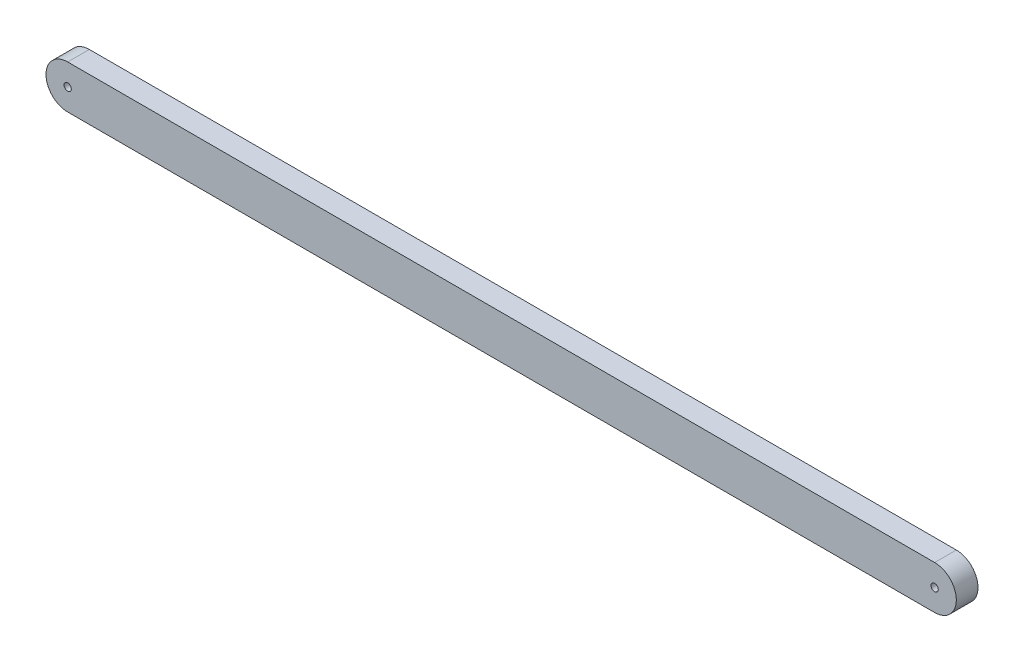
ISO-10303-21;
HEADER;
FILE_DESCRIPTION(('STEP AP214'),'2;1');
FILE_NAME('part.step','',(''),(''),'','','');
FILE_SCHEMA(('AUTOMOTIVE_DESIGN { 1 0 10303 214 1 1 1 1 }'));
ENDSEC;
DATA;
#1=APPLICATION_CONTEXT('core data for automotive mechanical design processes');
#2=APPLICATION_PROTOCOL_DEFINITION('international standard','automotive_design',2000,#1);
#3=PRODUCT_CONTEXT('',#1,'mechanical');
#4=PRODUCT('Part','Part','',(#3));
#5=PRODUCT_RELATED_PRODUCT_CATEGORY('part','',(#4));
#6=PRODUCT_DEFINITION_FORMATION('','',#4);
#7=PRODUCT_DEFINITION_CONTEXT('part definition',#1,'design');
#8=PRODUCT_DEFINITION('design','',#6,#7);
#9=PRODUCT_DEFINITION_SHAPE('','',#8);
#10=(LENGTH_UNIT() NAMED_UNIT(*) SI_UNIT(.MILLI.,.METRE.));
#11=(NAMED_UNIT(*) PLANE_ANGLE_UNIT() SI_UNIT($,.RADIAN.));
#12=(NAMED_UNIT(*) SI_UNIT($,.STERADIAN.) SOLID_ANGLE_UNIT());
#13=UNCERTAINTY_MEASURE_WITH_UNIT(LENGTH_MEASURE(1.E-05),#10,'distance_accuracy_value','');
#14=(GEOMETRIC_REPRESENTATION_CONTEXT(3) GLOBAL_UNCERTAINTY_ASSIGNED_CONTEXT((#13)) GLOBAL_UNIT_ASSIGNED_CONTEXT((#10,
#11,#12)) REPRESENTATION_CONTEXT('',''));
#15=CARTESIAN_POINT('',(0.,0.,0.));
#16=DIRECTION('',(0.,0.,1.));
#17=DIRECTION('',(1.,0.,0.));
#18=AXIS2_PLACEMENT_3D('',#15,#16,#17);
#19=CARTESIAN_POINT('',(0.,0.,3.));
#20=DIRECTION('',(0.,0.,1.));
#21=DIRECTION('',(1.,0.,0.));
#22=AXIS2_PLACEMENT_3D('',#19,#20,#21);
#23=PLANE('',#22);
#24=CARTESIAN_POINT('',(0.,0.,3.));
#25=DIRECTION('',(0.,0.,1.));
#26=DIRECTION('',(1.,0.,0.));
#27=AXIS2_PLACEMENT_3D('',#24,#25,#26);
#28=CIRCLE('',#27,0.5);
#29=CARTESIAN_POINT('',(0.5,0.,3.));
#30=VERTEX_POINT('',#29);
#31=EDGE_CURVE('E100',#30,#30,#28,.T.);
#32=ORIENTED_EDGE('',*,*,#31,.F.);
#33=EDGE_LOOP('',(#32));
#34=FACE_BOUND('',#33,.T.);
#35=CARTESIAN_POINT('',(0.,0.,3.));
#36=DIRECTION('',(0.,0.,1.));
#37=DIRECTION('',(1.,0.,0.));
#38=AXIS2_PLACEMENT_3D('',#35,#36,#37);
#39=CIRCLE('',#38,3.);
#40=CARTESIAN_POINT('',(0.,3.,3.));
#41=VERTEX_POINT('',#40);
#42=CARTESIAN_POINT('',(0.,-3.,3.));
#43=VERTEX_POINT('',#42);
#44=EDGE_CURVE('E85',#41,#43,#39,.T.);
#45=ORIENTED_EDGE('',*,*,#44,.T.);
#46=DIRECTION('',(1.,0.,0.));
#47=VECTOR('',#46,1.);
#48=CARTESIAN_POINT('',(0.,-3.,3.));
#49=LINE('',#48,#47);
#50=CARTESIAN_POINT('',(120.,-3.,3.));
#51=VERTEX_POINT('',#50);
#52=EDGE_CURVE('E80',#43,#51,#49,.T.);
#53=ORIENTED_EDGE('',*,*,#52,.T.);
#54=CARTESIAN_POINT('',(120.,0.,3.));
#55=DIRECTION('',(0.,0.,1.));
#56=DIRECTION('',(1.,0.,0.));
#57=AXIS2_PLACEMENT_3D('',#54,#55,#56);
#58=CIRCLE('',#57,3.);
#59=CARTESIAN_POINT('',(120.,3.,3.));
#60=VERTEX_POINT('',#59);
#61=EDGE_CURVE('E83',#51,#60,#58,.T.);
#62=ORIENTED_EDGE('',*,*,#61,.T.);
#63=DIRECTION('',(-1.,0.,0.));
#64=VECTOR('',#63,1.);
#65=CARTESIAN_POINT('',(0.,3.,3.));
#66=LINE('',#65,#64);
#67=EDGE_CURVE('E50',#60,#41,#66,.T.);
#68=ORIENTED_EDGE('',*,*,#67,.T.);
#69=EDGE_LOOP('',(#45,#53,#62,#68));
#70=FACE_BOUND('',#69,.T.);
#71=CARTESIAN_POINT('',(120.,0.,3.));
#72=DIRECTION('',(0.,0.,1.));
#73=DIRECTION('',(1.,0.,0.));
#74=AXIS2_PLACEMENT_3D('',#71,#72,#73);
#75=CIRCLE('',#74,0.499999999999999);
#76=CARTESIAN_POINT('',(120.5,0.,3.));
#77=VERTEX_POINT('',#76);
#78=EDGE_CURVE('E115',#77,#77,#75,.T.);
#79=ORIENTED_EDGE('',*,*,#78,.F.);
#80=EDGE_LOOP('',(#79));
#81=FACE_BOUND('',#80,.T.);
#82=ADVANCED_FACE('F33',(#34,#70,#81),#23,.T.);
#83=CARTESIAN_POINT('',(0.,0.,0.));
#84=DIRECTION('',(0.,0.,1.));
#85=DIRECTION('',(1.,0.,0.));
#86=AXIS2_PLACEMENT_3D('',#83,#84,#85);
#87=PLANE('',#86);
#88=CARTESIAN_POINT('',(0.,0.,0.));
#89=DIRECTION('',(0.,0.,1.));
#90=DIRECTION('',(1.,0.,0.));
#91=AXIS2_PLACEMENT_3D('',#88,#89,#90);
#92=CIRCLE('',#91,3.);
#93=CARTESIAN_POINT('',(0.,3.,0.));
#94=VERTEX_POINT('',#93);
#95=CARTESIAN_POINT('',(0.,-3.,0.));
#96=VERTEX_POINT('',#95);
#97=EDGE_CURVE('E97',#94,#96,#92,.T.);
#98=ORIENTED_EDGE('',*,*,#97,.F.);
#99=DIRECTION('',(-1.,0.,0.));
#100=VECTOR('',#99,1.);
#101=CARTESIAN_POINT('',(0.,3.,0.));
#102=LINE('',#101,#100);
#103=CARTESIAN_POINT('',(120.,3.,0.));
#104=VERTEX_POINT('',#103);
#105=EDGE_CURVE('E73',#104,#94,#102,.T.);
#106=ORIENTED_EDGE('',*,*,#105,.F.);
#107=CARTESIAN_POINT('',(120.,0.,0.));
#108=DIRECTION('',(0.,0.,1.));
#109=DIRECTION('',(1.,0.,0.));
#110=AXIS2_PLACEMENT_3D('',#107,#108,#109);
#111=CIRCLE('',#110,3.);
#112=CARTESIAN_POINT('',(120.,-3.,0.));
#113=VERTEX_POINT('',#112);
#114=EDGE_CURVE('E67',#113,#104,#111,.T.);
#115=ORIENTED_EDGE('',*,*,#114,.F.);
#116=DIRECTION('',(1.,0.,0.));
#117=VECTOR('',#116,1.);
#118=CARTESIAN_POINT('',(0.,-3.,0.));
#119=LINE('',#118,#117);
#120=EDGE_CURVE('E89',#96,#113,#119,.T.);
#121=ORIENTED_EDGE('',*,*,#120,.F.);
#122=EDGE_LOOP('',(#98,#106,#115,#121));
#123=FACE_BOUND('',#122,.T.);
#124=CARTESIAN_POINT('',(0.,0.,0.));
#125=DIRECTION('',(0.,0.,1.));
#126=DIRECTION('',(1.,0.,0.));
#127=AXIS2_PLACEMENT_3D('',#124,#125,#126);
#128=CIRCLE('',#127,0.5);
#129=CARTESIAN_POINT('',(0.5,0.,0.));
#130=VERTEX_POINT('',#129);
#131=EDGE_CURVE('E112',#130,#130,#128,.T.);
#132=ORIENTED_EDGE('',*,*,#131,.T.);
#133=EDGE_LOOP('',(#132));
#134=FACE_BOUND('',#133,.T.);
#135=CARTESIAN_POINT('',(120.,0.,0.));
#136=DIRECTION('',(0.,0.,1.));
#137=DIRECTION('',(1.,0.,0.));
#138=AXIS2_PLACEMENT_3D('',#135,#136,#137);
#139=CIRCLE('',#138,0.499999999999999);
#140=CARTESIAN_POINT('',(120.5,0.,0.));
#141=VERTEX_POINT('',#140);
#142=EDGE_CURVE('E118',#141,#141,#139,.T.);
#143=ORIENTED_EDGE('',*,*,#142,.T.);
#144=EDGE_LOOP('',(#143));
#145=FACE_BOUND('',#144,.T.);
#146=ADVANCED_FACE('F108',(#123,#134,#145),#87,.F.);
#147=CARTESIAN_POINT('',(0.,0.,3.));
#148=DIRECTION('',(0.,0.,-1.));
#149=DIRECTION('',(-1.,0.,0.));
#150=AXIS2_PLACEMENT_3D('',#147,#148,#149);
#151=CYLINDRICAL_SURFACE('',#150,3.);
#152=ORIENTED_EDGE('',*,*,#97,.T.);
#153=DIRECTION('',(0.,0.,-1.));
#154=VECTOR('',#153,1.);
#155=CARTESIAN_POINT('',(0.,-3.,3.));
#156=LINE('',#155,#154);
#157=EDGE_CURVE('E11',#43,#96,#156,.T.);
#158=ORIENTED_EDGE('',*,*,#157,.F.);
#159=ORIENTED_EDGE('',*,*,#44,.F.);
#160=DIRECTION('',(0.,0.,-1.));
#161=VECTOR('',#160,1.);
#162=CARTESIAN_POINT('',(0.,3.,3.));
#163=LINE('',#162,#161);
#164=EDGE_CURVE('E93',#41,#94,#163,.T.);
#165=ORIENTED_EDGE('',*,*,#164,.T.);
#166=EDGE_LOOP('',(#152,#158,#159,#165));
#167=FACE_BOUND('',#166,.T.);
#168=ADVANCED_FACE('F35',(#167),#151,.T.);
#169=CARTESIAN_POINT('',(0.,-3.,3.));
#170=DIRECTION('',(0.,1.,0.));
#171=DIRECTION('',(0.,0.,1.));
#172=AXIS2_PLACEMENT_3D('',#169,#170,#171);
#173=PLANE('',#172);
#174=ORIENTED_EDGE('',*,*,#120,.T.);
#175=DIRECTION('',(0.,0.,-1.));
#176=VECTOR('',#175,1.);
#177=CARTESIAN_POINT('',(120.,-3.,3.));
#178=LINE('',#177,#176);
#179=EDGE_CURVE('E42',#51,#113,#178,.T.);
#180=ORIENTED_EDGE('',*,*,#179,.F.);
#181=ORIENTED_EDGE('',*,*,#52,.F.);
#182=ORIENTED_EDGE('',*,*,#157,.T.);
#183=EDGE_LOOP('',(#174,#180,#181,#182));
#184=FACE_BOUND('',#183,.T.);
#185=ADVANCED_FACE('F88',(#184),#173,.F.);
#186=CARTESIAN_POINT('',(120.,0.,3.));
#187=DIRECTION('',(0.,0.,-1.));
#188=DIRECTION('',(-1.,0.,0.));
#189=AXIS2_PLACEMENT_3D('',#186,#187,#188);
#190=CYLINDRICAL_SURFACE('',#189,3.);
#191=ORIENTED_EDGE('',*,*,#114,.T.);
#192=DIRECTION('',(0.,0.,-1.));
#193=VECTOR('',#192,1.);
#194=CARTESIAN_POINT('',(120.,3.,3.));
#195=LINE('',#194,#193);
#196=EDGE_CURVE('E90',#60,#104,#195,.T.);
#197=ORIENTED_EDGE('',*,*,#196,.F.);
#198=ORIENTED_EDGE('',*,*,#61,.F.);
#199=ORIENTED_EDGE('',*,*,#179,.T.);
#200=EDGE_LOOP('',(#191,#197,#198,#199));
#201=FACE_BOUND('',#200,.T.);
#202=ADVANCED_FACE('F91',(#201),#190,.T.);
#203=CARTESIAN_POINT('',(0.,3.,3.));
#204=DIRECTION('',(0.,-1.,0.));
#205=DIRECTION('',(0.,0.,-1.));
#206=AXIS2_PLACEMENT_3D('',#203,#204,#205);
#207=PLANE('',#206);
#208=ORIENTED_EDGE('',*,*,#105,.T.);
#209=ORIENTED_EDGE('',*,*,#164,.F.);
#210=ORIENTED_EDGE('',*,*,#67,.F.);
#211=ORIENTED_EDGE('',*,*,#196,.T.);
#212=EDGE_LOOP('',(#208,#209,#210,#211));
#213=FACE_BOUND('',#212,.T.);
#214=ADVANCED_FACE('F105',(#213),#207,.F.);
#215=CARTESIAN_POINT('',(0.,0.,3.));
#216=DIRECTION('',(0.,0.,-1.));
#217=DIRECTION('',(-1.,0.,0.));
#218=AXIS2_PLACEMENT_3D('',#215,#216,#217);
#219=CYLINDRICAL_SURFACE('',#218,0.5);
#220=ORIENTED_EDGE('',*,*,#31,.T.);
#221=EDGE_LOOP('',(#220));
#222=FACE_BOUND('',#221,.T.);
#223=ORIENTED_EDGE('',*,*,#131,.F.);
#224=EDGE_LOOP('',(#223));
#225=FACE_BOUND('',#224,.T.);
#226=ADVANCED_FACE('F135',(#222,#225),#219,.F.);
#227=CARTESIAN_POINT('',(120.,0.,3.));
#228=DIRECTION('',(0.,0.,-1.));
#229=DIRECTION('',(-1.,0.,0.));
#230=AXIS2_PLACEMENT_3D('',#227,#228,#229);
#231=CYLINDRICAL_SURFACE('',#230,0.499999999999999);
#232=ORIENTED_EDGE('',*,*,#78,.T.);
#233=EDGE_LOOP('',(#232));
#234=FACE_BOUND('',#233,.T.);
#235=ORIENTED_EDGE('',*,*,#142,.F.);
#236=EDGE_LOOP('',(#235));
#237=FACE_BOUND('',#236,.T.);
#238=ADVANCED_FACE('F124',(#234,#237),#231,.F.);
#239=CLOSED_SHELL('',(#82,#146,#168,#185,#202,#214,#226,#238));
#240=MANIFOLD_SOLID_BREP('B2',#239);
#241=ADVANCED_BREP_SHAPE_REPRESENTATION('',(#18,#240),#14);
#242=SHAPE_DEFINITION_REPRESENTATION(#9,#241);
ENDSEC;
END-ISO-10303-21;
